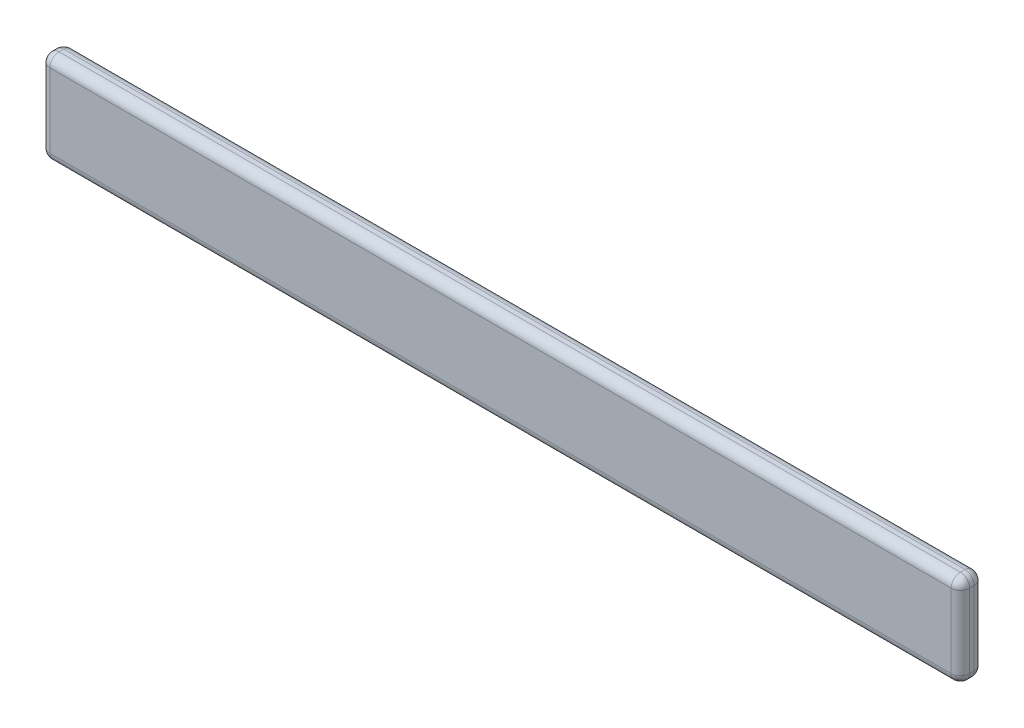
ISO-10303-21;
HEADER;
FILE_DESCRIPTION(('STEP AP214'),'2;1');
FILE_NAME('part.step','',(''),(''),'','','');
FILE_SCHEMA(('AUTOMOTIVE_DESIGN { 1 0 10303 214 1 1 1 1 }'));
ENDSEC;
DATA;
#1=APPLICATION_CONTEXT('core data for automotive mechanical design processes');
#2=APPLICATION_PROTOCOL_DEFINITION('international standard','automotive_design',2000,#1);
#3=PRODUCT_CONTEXT('',#1,'mechanical');
#4=PRODUCT('Part','Part','',(#3));
#5=PRODUCT_RELATED_PRODUCT_CATEGORY('part','',(#4));
#6=PRODUCT_DEFINITION_FORMATION('','',#4);
#7=PRODUCT_DEFINITION_CONTEXT('part definition',#1,'design');
#8=PRODUCT_DEFINITION('design','',#6,#7);
#9=PRODUCT_DEFINITION_SHAPE('','',#8);
#10=(LENGTH_UNIT() NAMED_UNIT(*) SI_UNIT(.MILLI.,.METRE.));
#11=(NAMED_UNIT(*) PLANE_ANGLE_UNIT() SI_UNIT($,.RADIAN.));
#12=(NAMED_UNIT(*) SI_UNIT($,.STERADIAN.) SOLID_ANGLE_UNIT());
#13=UNCERTAINTY_MEASURE_WITH_UNIT(LENGTH_MEASURE(1.E-05),#10,'distance_accuracy_value','');
#14=(GEOMETRIC_REPRESENTATION_CONTEXT(3) GLOBAL_UNCERTAINTY_ASSIGNED_CONTEXT((#13)) GLOBAL_UNIT_ASSIGNED_CONTEXT((#10,
#11,#12)) REPRESENTATION_CONTEXT('',''));
#15=CARTESIAN_POINT('',(0.,0.,0.));
#16=DIRECTION('',(0.,0.,1.));
#17=DIRECTION('',(1.,0.,0.));
#18=AXIS2_PLACEMENT_3D('',#15,#16,#17);
#19=CARTESIAN_POINT('',(1990.,-100.,25.));
#20=DIRECTION('',(0.,0.,-1.));
#21=DIRECTION('',(-1.,0.,0.));
#22=AXIS2_PLACEMENT_3D('',#19,#20,#21);
#23=PLANE('',#22);
#24=DIRECTION('',(0.,-1.,0.));
#25=VECTOR('',#24,1.);
#26=CARTESIAN_POINT('',(1970.,100.,25.));
#27=LINE('',#26,#25);
#28=CARTESIAN_POINT('',(1970.,-80.,25.));
#29=VERTEX_POINT('',#28);
#30=CARTESIAN_POINT('',(1970.,80.,25.));
#31=VERTEX_POINT('',#30);
#32=EDGE_CURVE('E42',#29,#31,#27,.F.);
#33=ORIENTED_EDGE('',*,*,#32,.T.);
#34=DIRECTION('',(-1.,0.,0.));
#35=VECTOR('',#34,1.);
#36=CARTESIAN_POINT('',(1990.,80.,25.));
#37=LINE('',#36,#35);
#38=CARTESIAN_POINT('',(20.,80.,25.));
#39=VERTEX_POINT('',#38);
#40=EDGE_CURVE('E11',#31,#39,#37,.T.);
#41=ORIENTED_EDGE('',*,*,#40,.T.);
#42=DIRECTION('',(0.,-1.,0.));
#43=VECTOR('',#42,1.);
#44=CARTESIAN_POINT('',(20.,-100.,25.));
#45=LINE('',#44,#43);
#46=CARTESIAN_POINT('',(20.,-80.,25.));
#47=VERTEX_POINT('',#46);
#48=EDGE_CURVE('E198',#39,#47,#45,.T.);
#49=ORIENTED_EDGE('',*,*,#48,.T.);
#50=DIRECTION('',(-1.,0.,0.));
#51=VECTOR('',#50,1.);
#52=CARTESIAN_POINT('',(1990.,-80.,25.));
#53=LINE('',#52,#51);
#54=EDGE_CURVE('E53',#47,#29,#53,.F.);
#55=ORIENTED_EDGE('',*,*,#54,.T.);
#56=EDGE_LOOP('',(#33,#41,#49,#55));
#57=FACE_BOUND('',#56,.T.);
#58=ADVANCED_FACE('F33',(#57),#23,.F.);
#59=CARTESIAN_POINT('',(1990.,-100.,-25.));
#60=DIRECTION('',(0.,1.,0.));
#61=DIRECTION('',(0.,0.,1.));
#62=AXIS2_PLACEMENT_3D('',#59,#60,#61);
#63=PLANE('',#62);
#64=DIRECTION('',(0.,0.,-1.));
#65=VECTOR('',#64,1.);
#66=CARTESIAN_POINT('',(20.,-100.,-25.));
#67=LINE('',#66,#65);
#68=CARTESIAN_POINT('',(20.,-100.,5.));
#69=VERTEX_POINT('',#68);
#70=CARTESIAN_POINT('',(20.,-100.,-5.00000000000001));
#71=VERTEX_POINT('',#70);
#72=EDGE_CURVE('E132',#69,#71,#67,.T.);
#73=ORIENTED_EDGE('',*,*,#72,.T.);
#74=DIRECTION('',(-1.,0.,0.));
#75=VECTOR('',#74,1.);
#76=CARTESIAN_POINT('',(1990.,-100.,-5.00000000000001));
#77=LINE('',#76,#75);
#78=CARTESIAN_POINT('',(1970.,-100.,-5.00000000000001));
#79=VERTEX_POINT('',#78);
#80=EDGE_CURVE('E128',#71,#79,#77,.F.);
#81=ORIENTED_EDGE('',*,*,#80,.T.);
#82=DIRECTION('',(0.,0.,-1.));
#83=VECTOR('',#82,1.);
#84=CARTESIAN_POINT('',(1970.,-100.,25.));
#85=LINE('',#84,#83);
#86=CARTESIAN_POINT('',(1970.,-100.,5.));
#87=VERTEX_POINT('',#86);
#88=EDGE_CURVE('E120',#79,#87,#85,.F.);
#89=ORIENTED_EDGE('',*,*,#88,.T.);
#90=DIRECTION('',(-1.,0.,0.));
#91=VECTOR('',#90,1.);
#92=CARTESIAN_POINT('',(1990.,-100.,5.));
#93=LINE('',#92,#91);
#94=EDGE_CURVE('E125',#87,#69,#93,.T.);
#95=ORIENTED_EDGE('',*,*,#94,.T.);
#96=EDGE_LOOP('',(#73,#81,#89,#95));
#97=FACE_BOUND('',#96,.T.);
#98=ADVANCED_FACE('F123',(#97),#63,.F.);
#99=CARTESIAN_POINT('',(1990.,-100.,-25.));
#100=DIRECTION('',(0.,0.,1.));
#101=DIRECTION('',(1.,0.,0.));
#102=AXIS2_PLACEMENT_3D('',#99,#100,#101);
#103=PLANE('',#102);
#104=DIRECTION('',(0.,1.,0.));
#105=VECTOR('',#104,1.);
#106=CARTESIAN_POINT('',(1970.,-100.,-25.));
#107=LINE('',#106,#105);
#108=CARTESIAN_POINT('',(1970.,80.,-25.));
#109=VERTEX_POINT('',#108);
#110=CARTESIAN_POINT('',(1970.,-80.,-25.));
#111=VERTEX_POINT('',#110);
#112=EDGE_CURVE('E193',#109,#111,#107,.F.);
#113=ORIENTED_EDGE('',*,*,#112,.T.);
#114=DIRECTION('',(-1.,0.,0.));
#115=VECTOR('',#114,1.);
#116=CARTESIAN_POINT('',(1990.,-80.,-25.));
#117=LINE('',#116,#115);
#118=CARTESIAN_POINT('',(20.,-80.,-25.));
#119=VERTEX_POINT('',#118);
#120=EDGE_CURVE('E195',#111,#119,#117,.T.);
#121=ORIENTED_EDGE('',*,*,#120,.T.);
#122=DIRECTION('',(0.,1.,0.));
#123=VECTOR('',#122,1.);
#124=CARTESIAN_POINT('',(20.,-100.,-25.));
#125=LINE('',#124,#123);
#126=CARTESIAN_POINT('',(20.,80.,-25.));
#127=VERTEX_POINT('',#126);
#128=EDGE_CURVE('E189',#119,#127,#125,.T.);
#129=ORIENTED_EDGE('',*,*,#128,.T.);
#130=DIRECTION('',(-1.,0.,0.));
#131=VECTOR('',#130,1.);
#132=CARTESIAN_POINT('',(1990.,80.,-25.));
#133=LINE('',#132,#131);
#134=EDGE_CURVE('E191',#127,#109,#133,.F.);
#135=ORIENTED_EDGE('',*,*,#134,.T.);
#136=EDGE_LOOP('',(#113,#121,#129,#135));
#137=FACE_BOUND('',#136,.T.);
#138=ADVANCED_FACE('F264',(#137),#103,.F.);
#139=CARTESIAN_POINT('',(1990.,100.,-25.));
#140=DIRECTION('',(0.,-1.,0.));
#141=DIRECTION('',(0.,0.,-1.));
#142=AXIS2_PLACEMENT_3D('',#139,#140,#141);
#143=PLANE('',#142);
#144=DIRECTION('',(0.,0.,1.));
#145=VECTOR('',#144,1.);
#146=CARTESIAN_POINT('',(1970.,100.,-25.));
#147=LINE('',#146,#145);
#148=CARTESIAN_POINT('',(1970.,100.,5.00000000000001));
#149=VERTEX_POINT('',#148);
#150=CARTESIAN_POINT('',(1970.,100.,-5.));
#151=VERTEX_POINT('',#150);
#152=EDGE_CURVE('E184',#149,#151,#147,.F.);
#153=ORIENTED_EDGE('',*,*,#152,.T.);
#154=DIRECTION('',(-1.,0.,0.));
#155=VECTOR('',#154,1.);
#156=CARTESIAN_POINT('',(1990.,100.,-5.));
#157=LINE('',#156,#155);
#158=CARTESIAN_POINT('',(20.,100.,-5.));
#159=VERTEX_POINT('',#158);
#160=EDGE_CURVE('E187',#151,#159,#157,.T.);
#161=ORIENTED_EDGE('',*,*,#160,.T.);
#162=DIRECTION('',(0.,0.,1.));
#163=VECTOR('',#162,1.);
#164=CARTESIAN_POINT('',(20.,100.,-25.));
#165=LINE('',#164,#163);
#166=CARTESIAN_POINT('',(20.,100.,5.00000000000001));
#167=VERTEX_POINT('',#166);
#168=EDGE_CURVE('E182',#159,#167,#165,.T.);
#169=ORIENTED_EDGE('',*,*,#168,.T.);
#170=DIRECTION('',(-1.,0.,0.));
#171=VECTOR('',#170,1.);
#172=CARTESIAN_POINT('',(1990.,100.,5.00000000000001));
#173=LINE('',#172,#171);
#174=EDGE_CURVE('E180',#167,#149,#173,.F.);
#175=ORIENTED_EDGE('',*,*,#174,.T.);
#176=EDGE_LOOP('',(#153,#161,#169,#175));
#177=FACE_BOUND('',#176,.T.);
#178=ADVANCED_FACE('F273',(#177),#143,.F.);
#179=CARTESIAN_POINT('',(1990.,0.,0.));
#180=DIRECTION('',(1.,0.,0.));
#181=DIRECTION('',(0.,0.,-1.));
#182=AXIS2_PLACEMENT_3D('',#179,#180,#181);
#183=PLANE('',#182);
#184=DIRECTION('',(0.,0.,-1.));
#185=VECTOR('',#184,1.);
#186=CARTESIAN_POINT('',(1990.,-80.,-25.));
#187=LINE('',#186,#185);
#188=CARTESIAN_POINT('',(1990.,-80.,5.));
#189=VERTEX_POINT('',#188);
#190=CARTESIAN_POINT('',(1990.,-80.,-5.00000000000001));
#191=VERTEX_POINT('',#190);
#192=EDGE_CURVE('E140',#189,#191,#187,.T.);
#193=ORIENTED_EDGE('',*,*,#192,.T.);
#194=DIRECTION('',(0.,1.,0.));
#195=VECTOR('',#194,1.);
#196=CARTESIAN_POINT('',(1990.,100.,-5.00000000000001));
#197=LINE('',#196,#195);
#198=CARTESIAN_POINT('',(1990.,80.,-5.00000000000001));
#199=VERTEX_POINT('',#198);
#200=EDGE_CURVE('E178',#191,#199,#197,.T.);
#201=ORIENTED_EDGE('',*,*,#200,.T.);
#202=DIRECTION('',(0.,0.,1.));
#203=VECTOR('',#202,1.);
#204=CARTESIAN_POINT('',(1990.,80.,25.));
#205=LINE('',#204,#203);
#206=CARTESIAN_POINT('',(1990.,80.,5.));
#207=VERTEX_POINT('',#206);
#208=EDGE_CURVE('E175',#199,#207,#205,.T.);
#209=ORIENTED_EDGE('',*,*,#208,.T.);
#210=DIRECTION('',(0.,-1.,0.));
#211=VECTOR('',#210,1.);
#212=CARTESIAN_POINT('',(1990.,-100.,5.));
#213=LINE('',#212,#211);
#214=EDGE_CURVE('E173',#207,#189,#213,.T.);
#215=ORIENTED_EDGE('',*,*,#214,.T.);
#216=EDGE_LOOP('',(#193,#201,#209,#215));
#217=FACE_BOUND('',#216,.T.);
#218=ADVANCED_FACE('F476',(#217),#183,.T.);
#219=CARTESIAN_POINT('',(0.,0.,0.));
#220=DIRECTION('',(1.,0.,0.));
#221=DIRECTION('',(0.,0.,-1.));
#222=AXIS2_PLACEMENT_3D('',#219,#220,#221);
#223=PLANE('',#222);
#224=DIRECTION('',(0.,0.,1.));
#225=VECTOR('',#224,1.);
#226=CARTESIAN_POINT('',(0.,80.,0.));
#227=LINE('',#226,#225);
#228=CARTESIAN_POINT('',(0.,80.,5.));
#229=VERTEX_POINT('',#228);
#230=CARTESIAN_POINT('',(0.,80.,-5.00000000000001));
#231=VERTEX_POINT('',#230);
#232=EDGE_CURVE('E166',#229,#231,#227,.F.);
#233=ORIENTED_EDGE('',*,*,#232,.T.);
#234=DIRECTION('',(0.,1.,0.));
#235=VECTOR('',#234,1.);
#236=CARTESIAN_POINT('',(0.,0.,-5.00000000000001));
#237=LINE('',#236,#235);
#238=CARTESIAN_POINT('',(0.,-80.,-5.00000000000001));
#239=VERTEX_POINT('',#238);
#240=EDGE_CURVE('E171',#231,#239,#237,.F.);
#241=ORIENTED_EDGE('',*,*,#240,.T.);
#242=DIRECTION('',(0.,0.,-1.));
#243=VECTOR('',#242,1.);
#244=CARTESIAN_POINT('',(0.,-80.,0.));
#245=LINE('',#244,#243);
#246=CARTESIAN_POINT('',(0.,-80.,5.));
#247=VERTEX_POINT('',#246);
#248=EDGE_CURVE('E168',#239,#247,#245,.F.);
#249=ORIENTED_EDGE('',*,*,#248,.T.);
#250=DIRECTION('',(0.,-1.,0.));
#251=VECTOR('',#250,1.);
#252=CARTESIAN_POINT('',(0.,0.,5.));
#253=LINE('',#252,#251);
#254=EDGE_CURVE('E164',#247,#229,#253,.F.);
#255=ORIENTED_EDGE('',*,*,#254,.T.);
#256=EDGE_LOOP('',(#233,#241,#249,#255));
#257=FACE_BOUND('',#256,.T.);
#258=ADVANCED_FACE('F469',(#257),#223,.F.);
#259=CARTESIAN_POINT('',(1970.,80.,0.));
#260=DIRECTION('',(0.,0.,-1.));
#261=DIRECTION('',(0.,1.,0.));
#262=AXIS2_PLACEMENT_3D('',#259,#260,#261);
#263=CYLINDRICAL_SURFACE('',#262,20.);
#264=CARTESIAN_POINT('',(1970.,80.,5.));
#265=DIRECTION('',(0.,0.,1.));
#266=DIRECTION('',(0.,-1.,0.));
#267=AXIS2_PLACEMENT_3D('',#264,#265,#266);
#268=CIRCLE('',#267,20.);
#269=EDGE_CURVE('E37',#207,#149,#268,.T.);
#270=ORIENTED_EDGE('',*,*,#269,.F.);
#271=ORIENTED_EDGE('',*,*,#208,.F.);
#272=CARTESIAN_POINT('',(1970.,80.,-5.00000000000002));
#273=DIRECTION('',(0.,0.,-1.));
#274=DIRECTION('',(0.,1.,0.));
#275=AXIS2_PLACEMENT_3D('',#272,#273,#274);
#276=CIRCLE('',#275,20.);
#277=EDGE_CURVE('E160',#151,#199,#276,.T.);
#278=ORIENTED_EDGE('',*,*,#277,.F.);
#279=ORIENTED_EDGE('',*,*,#152,.F.);
#280=EDGE_LOOP('',(#270,#271,#278,#279));
#281=FACE_BOUND('',#280,.T.);
#282=ADVANCED_FACE('F35',(#281),#263,.T.);
#283=CARTESIAN_POINT('',(1970.,80.,5.));
#284=DIRECTION('',(0.,0.,1.));
#285=DIRECTION('',(1.,0.,0.));
#286=AXIS2_PLACEMENT_3D('',#283,#284,#285);
#287=SPHERICAL_SURFACE('',#286,20.);
#288=CARTESIAN_POINT('',(1970.,80.,4.99999999999999));
#289=DIRECTION('',(0.,1.,0.));
#290=DIRECTION('',(-1.,0.,0.));
#291=AXIS2_PLACEMENT_3D('',#288,#289,#290);
#292=CIRCLE('',#291,20.);
#293=EDGE_CURVE('E244',#207,#31,#292,.F.);
#294=ORIENTED_EDGE('',*,*,#293,.F.);
#295=ORIENTED_EDGE('',*,*,#269,.T.);
#296=CARTESIAN_POINT('',(1970.,80.,5.));
#297=DIRECTION('',(1.,0.,0.));
#298=DIRECTION('',(0.,0.,-1.));
#299=AXIS2_PLACEMENT_3D('',#296,#297,#298);
#300=CIRCLE('',#299,20.);
#301=EDGE_CURVE('E246',#31,#149,#300,.F.);
#302=ORIENTED_EDGE('',*,*,#301,.F.);
#303=EDGE_LOOP('',(#294,#295,#302));
#304=FACE_BOUND('',#303,.T.);
#305=ADVANCED_FACE('F454',(#304),#287,.T.);
#306=CARTESIAN_POINT('',(1970.,80.,-5.00000000000001));
#307=DIRECTION('',(0.,0.,1.));
#308=DIRECTION('',(1.,0.,0.));
#309=AXIS2_PLACEMENT_3D('',#306,#307,#308);
#310=SPHERICAL_SURFACE('',#309,20.);
#311=CARTESIAN_POINT('',(1970.,80.,-5.00000000000001));
#312=DIRECTION('',(1.,0.,0.));
#313=DIRECTION('',(0.,0.,-1.));
#314=AXIS2_PLACEMENT_3D('',#311,#312,#313);
#315=CIRCLE('',#314,20.);
#316=EDGE_CURVE('E238',#151,#109,#315,.F.);
#317=ORIENTED_EDGE('',*,*,#316,.F.);
#318=ORIENTED_EDGE('',*,*,#277,.T.);
#319=CARTESIAN_POINT('',(1970.,80.,-5.00000000000001));
#320=DIRECTION('',(0.,1.,0.));
#321=DIRECTION('',(0.,0.,1.));
#322=AXIS2_PLACEMENT_3D('',#319,#320,#321);
#323=CIRCLE('',#322,20.);
#324=EDGE_CURVE('E241',#109,#199,#323,.F.);
#325=ORIENTED_EDGE('',*,*,#324,.F.);
#326=EDGE_LOOP('',(#317,#318,#325));
#327=FACE_BOUND('',#326,.T.);
#328=ADVANCED_FACE('F253',(#327),#310,.T.);
#329=CARTESIAN_POINT('',(1990.,80.,5.));
#330=DIRECTION('',(-1.,0.,0.));
#331=DIRECTION('',(0.,0.,1.));
#332=AXIS2_PLACEMENT_3D('',#329,#330,#331);
#333=CYLINDRICAL_SURFACE('',#332,20.);
#334=ORIENTED_EDGE('',*,*,#301,.T.);
#335=ORIENTED_EDGE('',*,*,#174,.F.);
#336=CARTESIAN_POINT('',(20.,80.,4.99999999999999));
#337=DIRECTION('',(-1.,0.,0.));
#338=DIRECTION('',(0.,0.,1.));
#339=AXIS2_PLACEMENT_3D('',#336,#337,#338);
#340=CIRCLE('',#339,20.);
#341=EDGE_CURVE('E232',#39,#167,#340,.T.);
#342=ORIENTED_EDGE('',*,*,#341,.F.);
#343=ORIENTED_EDGE('',*,*,#40,.F.);
#344=EDGE_LOOP('',(#334,#335,#342,#343));
#345=FACE_BOUND('',#344,.T.);
#346=ADVANCED_FACE('F287',(#345),#333,.T.);
#347=CARTESIAN_POINT('',(1970.,0.,5.));
#348=DIRECTION('',(0.,1.,0.));
#349=DIRECTION('',(0.,0.,1.));
#350=AXIS2_PLACEMENT_3D('',#347,#348,#349);
#351=CYLINDRICAL_SURFACE('',#350,20.);
#352=ORIENTED_EDGE('',*,*,#293,.T.);
#353=ORIENTED_EDGE('',*,*,#32,.F.);
#354=CARTESIAN_POINT('',(1970.,-80.,5.));
#355=DIRECTION('',(0.,-1.,0.));
#356=DIRECTION('',(0.,0.,-1.));
#357=AXIS2_PLACEMENT_3D('',#354,#355,#356);
#358=CIRCLE('',#357,20.);
#359=EDGE_CURVE('E144',#189,#29,#358,.T.);
#360=ORIENTED_EDGE('',*,*,#359,.F.);
#361=ORIENTED_EDGE('',*,*,#214,.F.);
#362=EDGE_LOOP('',(#352,#353,#360,#361));
#363=FACE_BOUND('',#362,.T.);
#364=ADVANCED_FACE('F431',(#363),#351,.T.);
#365=CARTESIAN_POINT('',(1970.,-80.,0.));
#366=DIRECTION('',(0.,0.,1.));
#367=DIRECTION('',(1.,0.,0.));
#368=AXIS2_PLACEMENT_3D('',#365,#366,#367);
#369=CYLINDRICAL_SURFACE('',#368,20.);
#370=CARTESIAN_POINT('',(1970.,-80.,-5.00000000000001));
#371=DIRECTION('',(0.,0.,-1.));
#372=DIRECTION('',(-1.,0.,0.));
#373=AXIS2_PLACEMENT_3D('',#370,#371,#372);
#374=CIRCLE('',#373,20.);
#375=EDGE_CURVE('E145',#191,#79,#374,.T.);
#376=ORIENTED_EDGE('',*,*,#375,.F.);
#377=ORIENTED_EDGE('',*,*,#192,.F.);
#378=CARTESIAN_POINT('',(1970.,-80.,5.));
#379=DIRECTION('',(0.,0.,1.));
#380=DIRECTION('',(1.,0.,0.));
#381=AXIS2_PLACEMENT_3D('',#378,#379,#380);
#382=CIRCLE('',#381,20.);
#383=EDGE_CURVE('E136',#87,#189,#382,.T.);
#384=ORIENTED_EDGE('',*,*,#383,.F.);
#385=ORIENTED_EDGE('',*,*,#88,.F.);
#386=EDGE_LOOP('',(#376,#377,#384,#385));
#387=FACE_BOUND('',#386,.T.);
#388=ADVANCED_FACE('F138',(#387),#369,.T.);
#389=CARTESIAN_POINT('',(1970.,0.,-5.00000000000001));
#390=DIRECTION('',(0.,-1.,0.));
#391=DIRECTION('',(0.,0.,-1.));
#392=AXIS2_PLACEMENT_3D('',#389,#390,#391);
#393=CYLINDRICAL_SURFACE('',#392,20.);
#394=ORIENTED_EDGE('',*,*,#324,.T.);
#395=ORIENTED_EDGE('',*,*,#200,.F.);
#396=CARTESIAN_POINT('',(1970.,-80.,-5.00000000000001));
#397=DIRECTION('',(0.,-1.,0.));
#398=DIRECTION('',(0.,0.,-1.));
#399=AXIS2_PLACEMENT_3D('',#396,#397,#398);
#400=CIRCLE('',#399,20.);
#401=EDGE_CURVE('E228',#111,#191,#400,.T.);
#402=ORIENTED_EDGE('',*,*,#401,.F.);
#403=ORIENTED_EDGE('',*,*,#112,.F.);
#404=EDGE_LOOP('',(#394,#395,#402,#403));
#405=FACE_BOUND('',#404,.T.);
#406=ADVANCED_FACE('F260',(#405),#393,.T.);
#407=CARTESIAN_POINT('',(1990.,80.,-5.00000000000002));
#408=DIRECTION('',(-1.,0.,0.));
#409=DIRECTION('',(0.,0.,1.));
#410=AXIS2_PLACEMENT_3D('',#407,#408,#409);
#411=CYLINDRICAL_SURFACE('',#410,20.);
#412=ORIENTED_EDGE('',*,*,#316,.T.);
#413=ORIENTED_EDGE('',*,*,#134,.F.);
#414=CARTESIAN_POINT('',(20.,80.,-5.00000000000002));
#415=DIRECTION('',(-1.,0.,0.));
#416=DIRECTION('',(0.,0.,1.));
#417=AXIS2_PLACEMENT_3D('',#414,#415,#416);
#418=CIRCLE('',#417,20.);
#419=EDGE_CURVE('E225',#159,#127,#418,.T.);
#420=ORIENTED_EDGE('',*,*,#419,.F.);
#421=ORIENTED_EDGE('',*,*,#160,.F.);
#422=EDGE_LOOP('',(#412,#413,#420,#421));
#423=FACE_BOUND('',#422,.T.);
#424=ADVANCED_FACE('F270',(#423),#411,.T.);
#425=CARTESIAN_POINT('',(20.,80.,-25.));
#426=DIRECTION('',(0.,0.,1.));
#427=DIRECTION('',(0.,-1.,0.));
#428=AXIS2_PLACEMENT_3D('',#425,#426,#427);
#429=CYLINDRICAL_SURFACE('',#428,20.);
#430=CARTESIAN_POINT('',(20.,80.,5.));
#431=DIRECTION('',(0.,0.,1.));
#432=DIRECTION('',(0.,-1.,0.));
#433=AXIS2_PLACEMENT_3D('',#430,#431,#432);
#434=CIRCLE('',#433,20.);
#435=EDGE_CURVE('E235',#167,#229,#434,.T.);
#436=ORIENTED_EDGE('',*,*,#435,.F.);
#437=ORIENTED_EDGE('',*,*,#168,.F.);
#438=CARTESIAN_POINT('',(20.,80.,-5.00000000000001));
#439=DIRECTION('',(0.,0.,-1.));
#440=DIRECTION('',(0.,1.,0.));
#441=AXIS2_PLACEMENT_3D('',#438,#439,#440);
#442=CIRCLE('',#441,20.);
#443=EDGE_CURVE('E222',#231,#159,#442,.T.);
#444=ORIENTED_EDGE('',*,*,#443,.F.);
#445=ORIENTED_EDGE('',*,*,#232,.F.);
#446=EDGE_LOOP('',(#436,#437,#444,#445));
#447=FACE_BOUND('',#446,.T.);
#448=ADVANCED_FACE('F278',(#447),#429,.T.);
#449=CARTESIAN_POINT('',(20.,80.,5.));
#450=DIRECTION('',(0.,0.,1.));
#451=DIRECTION('',(1.,0.,0.));
#452=AXIS2_PLACEMENT_3D('',#449,#450,#451);
#453=SPHERICAL_SURFACE('',#452,20.);
#454=ORIENTED_EDGE('',*,*,#341,.T.);
#455=ORIENTED_EDGE('',*,*,#435,.T.);
#456=CARTESIAN_POINT('',(20.,80.,5.));
#457=DIRECTION('',(0.,1.,0.));
#458=DIRECTION('',(0.,0.,1.));
#459=AXIS2_PLACEMENT_3D('',#456,#457,#458);
#460=CIRCLE('',#459,20.);
#461=EDGE_CURVE('E151',#39,#229,#460,.F.);
#462=ORIENTED_EDGE('',*,*,#461,.F.);
#463=EDGE_LOOP('',(#454,#455,#462));
#464=FACE_BOUND('',#463,.T.);
#465=ADVANCED_FACE('F284',(#464),#453,.T.);
#466=CARTESIAN_POINT('',(1970.,-80.,5.));
#467=DIRECTION('',(0.,0.,1.));
#468=DIRECTION('',(1.,0.,0.));
#469=AXIS2_PLACEMENT_3D('',#466,#467,#468);
#470=SPHERICAL_SURFACE('',#469,20.);
#471=ORIENTED_EDGE('',*,*,#383,.T.);
#472=ORIENTED_EDGE('',*,*,#359,.T.);
#473=CARTESIAN_POINT('',(1970.,-80.,4.99999999999999));
#474=DIRECTION('',(1.,0.,0.));
#475=DIRECTION('',(0.,0.,-1.));
#476=AXIS2_PLACEMENT_3D('',#473,#474,#475);
#477=CIRCLE('',#476,20.);
#478=EDGE_CURVE('E148',#87,#29,#477,.F.);
#479=ORIENTED_EDGE('',*,*,#478,.F.);
#480=EDGE_LOOP('',(#471,#472,#479));
#481=FACE_BOUND('',#480,.T.);
#482=ADVANCED_FACE('F149',(#481),#470,.T.);
#483=CARTESIAN_POINT('',(1970.,-80.,-5.00000000000001));
#484=DIRECTION('',(0.,0.,1.));
#485=DIRECTION('',(1.,0.,0.));
#486=AXIS2_PLACEMENT_3D('',#483,#484,#485);
#487=SPHERICAL_SURFACE('',#486,20.);
#488=ORIENTED_EDGE('',*,*,#401,.T.);
#489=ORIENTED_EDGE('',*,*,#375,.T.);
#490=CARTESIAN_POINT('',(1970.,-80.,-5.00000000000001));
#491=DIRECTION('',(1.,0.,0.));
#492=DIRECTION('',(0.,0.,-1.));
#493=AXIS2_PLACEMENT_3D('',#490,#491,#492);
#494=CIRCLE('',#493,20.);
#495=EDGE_CURVE('E152',#111,#79,#494,.F.);
#496=ORIENTED_EDGE('',*,*,#495,.F.);
#497=EDGE_LOOP('',(#488,#489,#496));
#498=FACE_BOUND('',#497,.T.);
#499=ADVANCED_FACE('F306',(#498),#487,.T.);
#500=CARTESIAN_POINT('',(20.,80.,-5.00000000000001));
#501=DIRECTION('',(0.,0.,1.));
#502=DIRECTION('',(1.,0.,0.));
#503=AXIS2_PLACEMENT_3D('',#500,#501,#502);
#504=SPHERICAL_SURFACE('',#503,20.);
#505=ORIENTED_EDGE('',*,*,#443,.T.);
#506=ORIENTED_EDGE('',*,*,#419,.T.);
#507=CARTESIAN_POINT('',(20.,80.,-5.00000000000001));
#508=DIRECTION('',(0.,1.,0.));
#509=DIRECTION('',(0.,0.,1.));
#510=AXIS2_PLACEMENT_3D('',#507,#508,#509);
#511=CIRCLE('',#510,20.);
#512=EDGE_CURVE('E215',#231,#127,#511,.F.);
#513=ORIENTED_EDGE('',*,*,#512,.F.);
#514=EDGE_LOOP('',(#505,#506,#513));
#515=FACE_BOUND('',#514,.T.);
#516=ADVANCED_FACE('F308',(#515),#504,.T.);
#517=CARTESIAN_POINT('',(20.,-100.,5.));
#518=DIRECTION('',(0.,-1.,0.));
#519=DIRECTION('',(0.,0.,-1.));
#520=AXIS2_PLACEMENT_3D('',#517,#518,#519);
#521=CYLINDRICAL_SURFACE('',#520,20.);
#522=ORIENTED_EDGE('',*,*,#461,.T.);
#523=ORIENTED_EDGE('',*,*,#254,.F.);
#524=CARTESIAN_POINT('',(20.,-80.,4.99999999999999));
#525=DIRECTION('',(0.,-1.,0.));
#526=DIRECTION('',(0.,0.,-1.));
#527=AXIS2_PLACEMENT_3D('',#524,#525,#526);
#528=CIRCLE('',#527,20.);
#529=EDGE_CURVE('E212',#47,#247,#528,.T.);
#530=ORIENTED_EDGE('',*,*,#529,.F.);
#531=ORIENTED_EDGE('',*,*,#48,.F.);
#532=EDGE_LOOP('',(#522,#523,#530,#531));
#533=FACE_BOUND('',#532,.T.);
#534=ADVANCED_FACE('F291',(#533),#521,.T.);
#535=CARTESIAN_POINT('',(1990.,-80.,5.));
#536=DIRECTION('',(-1.,0.,0.));
#537=DIRECTION('',(0.,0.,1.));
#538=AXIS2_PLACEMENT_3D('',#535,#536,#537);
#539=CYLINDRICAL_SURFACE('',#538,20.);
#540=ORIENTED_EDGE('',*,*,#478,.T.);
#541=ORIENTED_EDGE('',*,*,#54,.F.);
#542=CARTESIAN_POINT('',(20.,-80.,5.));
#543=DIRECTION('',(-1.,0.,0.));
#544=DIRECTION('',(0.,0.,1.));
#545=AXIS2_PLACEMENT_3D('',#542,#543,#544);
#546=CIRCLE('',#545,20.);
#547=EDGE_CURVE('E156',#69,#47,#546,.T.);
#548=ORIENTED_EDGE('',*,*,#547,.F.);
#549=ORIENTED_EDGE('',*,*,#94,.F.);
#550=EDGE_LOOP('',(#540,#541,#548,#549));
#551=FACE_BOUND('',#550,.T.);
#552=ADVANCED_FACE('F154',(#551),#539,.T.);
#553=CARTESIAN_POINT('',(1990.,-80.,-5.00000000000001));
#554=DIRECTION('',(-1.,0.,0.));
#555=DIRECTION('',(0.,0.,1.));
#556=AXIS2_PLACEMENT_3D('',#553,#554,#555);
#557=CYLINDRICAL_SURFACE('',#556,20.);
#558=ORIENTED_EDGE('',*,*,#495,.T.);
#559=ORIENTED_EDGE('',*,*,#80,.F.);
#560=CARTESIAN_POINT('',(20.,-80.,-5.00000000000001));
#561=DIRECTION('',(-1.,0.,0.));
#562=DIRECTION('',(0.,0.,1.));
#563=AXIS2_PLACEMENT_3D('',#560,#561,#562);
#564=CIRCLE('',#563,20.);
#565=EDGE_CURVE('E208',#119,#71,#564,.T.);
#566=ORIENTED_EDGE('',*,*,#565,.F.);
#567=ORIENTED_EDGE('',*,*,#120,.F.);
#568=EDGE_LOOP('',(#558,#559,#566,#567));
#569=FACE_BOUND('',#568,.T.);
#570=ADVANCED_FACE('F304',(#569),#557,.T.);
#571=CARTESIAN_POINT('',(20.,-100.,-5.00000000000001));
#572=DIRECTION('',(0.,1.,0.));
#573=DIRECTION('',(0.,0.,1.));
#574=AXIS2_PLACEMENT_3D('',#571,#572,#573);
#575=CYLINDRICAL_SURFACE('',#574,20.);
#576=ORIENTED_EDGE('',*,*,#512,.T.);
#577=ORIENTED_EDGE('',*,*,#128,.F.);
#578=CARTESIAN_POINT('',(20.,-80.,-5.00000000000001));
#579=DIRECTION('',(0.,-1.,0.));
#580=DIRECTION('',(0.,0.,-1.));
#581=AXIS2_PLACEMENT_3D('',#578,#579,#580);
#582=CIRCLE('',#581,20.);
#583=EDGE_CURVE('E206',#239,#119,#582,.T.);
#584=ORIENTED_EDGE('',*,*,#583,.F.);
#585=ORIENTED_EDGE('',*,*,#240,.F.);
#586=EDGE_LOOP('',(#576,#577,#584,#585));
#587=FACE_BOUND('',#586,.T.);
#588=ADVANCED_FACE('F331',(#587),#575,.T.);
#589=CARTESIAN_POINT('',(20.,-80.,5.));
#590=DIRECTION('',(0.,0.,1.));
#591=DIRECTION('',(1.,0.,0.));
#592=AXIS2_PLACEMENT_3D('',#589,#590,#591);
#593=SPHERICAL_SURFACE('',#592,20.);
#594=ORIENTED_EDGE('',*,*,#547,.T.);
#595=ORIENTED_EDGE('',*,*,#529,.T.);
#596=CARTESIAN_POINT('',(20.,-80.,5.));
#597=DIRECTION('',(0.,0.,1.));
#598=DIRECTION('',(1.,0.,0.));
#599=AXIS2_PLACEMENT_3D('',#596,#597,#598);
#600=CIRCLE('',#599,20.);
#601=EDGE_CURVE('E204',#69,#247,#600,.F.);
#602=ORIENTED_EDGE('',*,*,#601,.F.);
#603=EDGE_LOOP('',(#594,#595,#602));
#604=FACE_BOUND('',#603,.T.);
#605=ADVANCED_FACE('F293',(#604),#593,.T.);
#606=CARTESIAN_POINT('',(20.,-80.,-5.00000000000001));
#607=DIRECTION('',(0.,0.,1.));
#608=DIRECTION('',(1.,0.,0.));
#609=AXIS2_PLACEMENT_3D('',#606,#607,#608);
#610=SPHERICAL_SURFACE('',#609,20.);
#611=ORIENTED_EDGE('',*,*,#583,.T.);
#612=ORIENTED_EDGE('',*,*,#565,.T.);
#613=CARTESIAN_POINT('',(20.,-80.,-5.00000000000001));
#614=DIRECTION('',(0.,0.,-1.));
#615=DIRECTION('',(-1.,0.,0.));
#616=AXIS2_PLACEMENT_3D('',#613,#614,#615);
#617=CIRCLE('',#616,20.);
#618=EDGE_CURVE('E202',#239,#71,#617,.F.);
#619=ORIENTED_EDGE('',*,*,#618,.F.);
#620=EDGE_LOOP('',(#611,#612,#619));
#621=FACE_BOUND('',#620,.T.);
#622=ADVANCED_FACE('F301',(#621),#610,.T.);
#623=CARTESIAN_POINT('',(20.,-80.,-25.));
#624=DIRECTION('',(0.,0.,-1.));
#625=DIRECTION('',(-1.,0.,0.));
#626=AXIS2_PLACEMENT_3D('',#623,#624,#625);
#627=CYLINDRICAL_SURFACE('',#626,20.);
#628=ORIENTED_EDGE('',*,*,#601,.T.);
#629=ORIENTED_EDGE('',*,*,#248,.F.);
#630=ORIENTED_EDGE('',*,*,#618,.T.);
#631=ORIENTED_EDGE('',*,*,#72,.F.);
#632=EDGE_LOOP('',(#628,#629,#630,#631));
#633=FACE_BOUND('',#632,.T.);
#634=ADVANCED_FACE('F297',(#633),#627,.T.);
#635=CLOSED_SHELL('',(#58,#98,#138,#178,#218,#258,#282,#305,#328,#346,#364,#388,#406,#424,#448,
#465,#482,#499,#516,#534,#552,#570,#588,#605,#622,#634));
#636=MANIFOLD_SOLID_BREP('B2',#635);
#637=ADVANCED_BREP_SHAPE_REPRESENTATION('',(#18,#636),#14);
#638=SHAPE_DEFINITION_REPRESENTATION(#9,#637);
ENDSEC;
END-ISO-10303-21;
